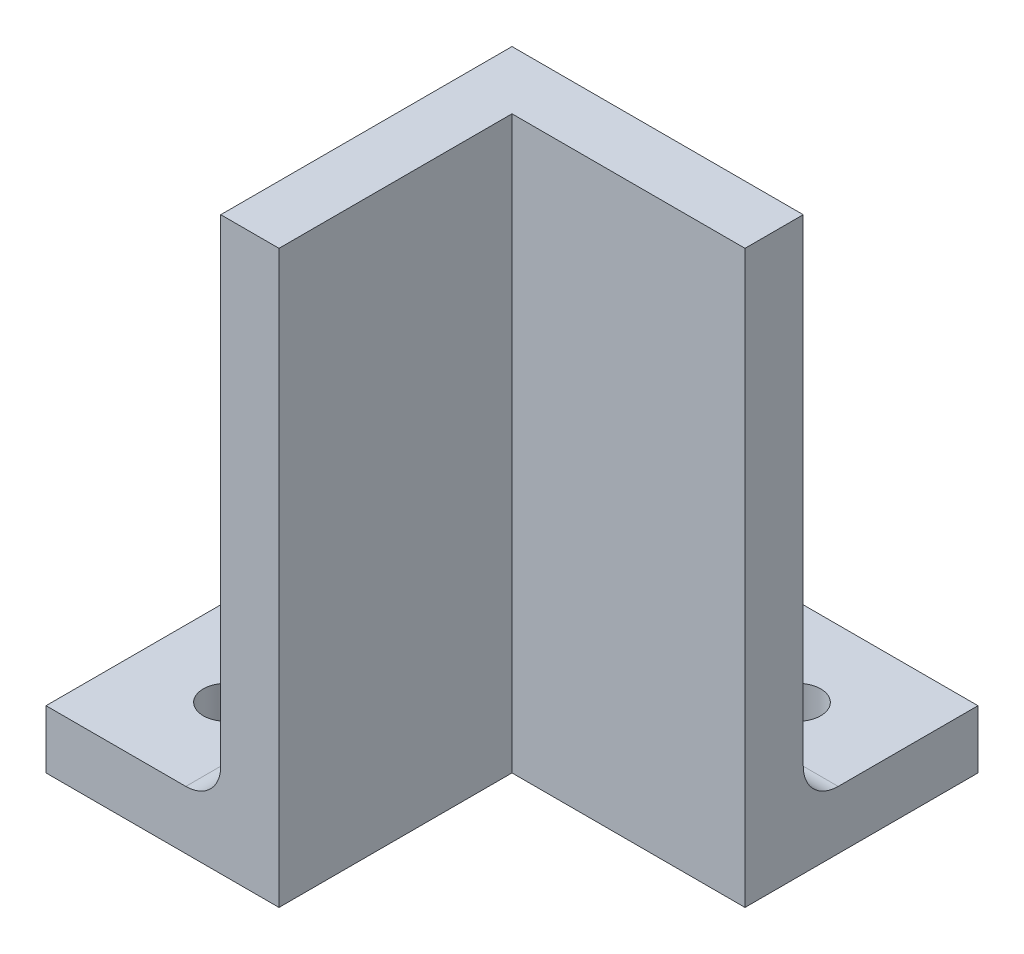
ISO-10303-21;
HEADER;
FILE_DESCRIPTION(('STEP AP214'),'2;1');
FILE_NAME('part.step','',(''),(''),'','','');
FILE_SCHEMA(('AUTOMOTIVE_DESIGN { 1 0 10303 214 1 1 1 1 }'));
ENDSEC;
DATA;
#1=APPLICATION_CONTEXT('core data for automotive mechanical design processes');
#2=APPLICATION_PROTOCOL_DEFINITION('international standard','automotive_design',2000,#1);
#3=PRODUCT_CONTEXT('',#1,'mechanical');
#4=PRODUCT('Part','Part','',(#3));
#5=PRODUCT_RELATED_PRODUCT_CATEGORY('part','',(#4));
#6=PRODUCT_DEFINITION_FORMATION('','',#4);
#7=PRODUCT_DEFINITION_CONTEXT('part definition',#1,'design');
#8=PRODUCT_DEFINITION('design','',#6,#7);
#9=PRODUCT_DEFINITION_SHAPE('','',#8);
#10=(LENGTH_UNIT() NAMED_UNIT(*) SI_UNIT(.MILLI.,.METRE.));
#11=(NAMED_UNIT(*) PLANE_ANGLE_UNIT() SI_UNIT($,.RADIAN.));
#12=(NAMED_UNIT(*) SI_UNIT($,.STERADIAN.) SOLID_ANGLE_UNIT());
#13=UNCERTAINTY_MEASURE_WITH_UNIT(LENGTH_MEASURE(1.E-05),#10,'distance_accuracy_value','');
#14=(GEOMETRIC_REPRESENTATION_CONTEXT(3) GLOBAL_UNCERTAINTY_ASSIGNED_CONTEXT((#13)) GLOBAL_UNIT_ASSIGNED_CONTEXT((#10,
#11,#12)) REPRESENTATION_CONTEXT('',''));
#15=CARTESIAN_POINT('',(0.,0.,0.));
#16=DIRECTION('',(0.,0.,1.));
#17=DIRECTION('',(1.,0.,0.));
#18=AXIS2_PLACEMENT_3D('',#15,#16,#17);
#19=CARTESIAN_POINT('',(0.,5.,0.));
#20=DIRECTION('',(0.,1.,0.));
#21=DIRECTION('',(0.,0.,1.));
#22=AXIS2_PLACEMENT_3D('',#19,#20,#21);
#23=PLANE('',#22);
#24=CARTESIAN_POINT('',(-12.5,5.,12.));
#25=DIRECTION('',(0.,1.,0.));
#26=DIRECTION('',(0.,0.,1.));
#27=AXIS2_PLACEMENT_3D('',#24,#25,#26);
#28=CIRCLE('',#27,2.);
#29=CARTESIAN_POINT('',(-12.5,5.,14.));
#30=VERTEX_POINT('',#29);
#31=EDGE_CURVE('E151',#30,#30,#28,.T.);
#32=ORIENTED_EDGE('',*,*,#31,.F.);
#33=EDGE_LOOP('',(#32));
#34=FACE_BOUND('',#33,.T.);
#35=CARTESIAN_POINT('',(-12.5,5.,0.));
#36=DIRECTION('',(0.,1.,0.));
#37=DIRECTION('',(0.,0.,1.));
#38=AXIS2_PLACEMENT_3D('',#35,#36,#37);
#39=CIRCLE('',#38,2.);
#40=CARTESIAN_POINT('',(-12.5,5.,2.));
#41=VERTEX_POINT('',#40);
#42=EDGE_CURVE('E217',#41,#41,#39,.T.);
#43=ORIENTED_EDGE('',*,*,#42,.F.);
#44=EDGE_LOOP('',(#43));
#45=FACE_BOUND('',#44,.T.);
#46=CARTESIAN_POINT('',(0.,5.,-12.5));
#47=DIRECTION('',(0.,1.,0.));
#48=DIRECTION('',(0.,0.,1.));
#49=AXIS2_PLACEMENT_3D('',#46,#47,#48);
#50=CIRCLE('',#49,2.);
#51=CARTESIAN_POINT('',(0.,5.,-10.5));
#52=VERTEX_POINT('',#51);
#53=EDGE_CURVE('E469',#52,#52,#50,.T.);
#54=ORIENTED_EDGE('',*,*,#53,.F.);
#55=EDGE_LOOP('',(#54));
#56=FACE_BOUND('',#55,.T.);
#57=CARTESIAN_POINT('',(12.,5.,-12.5));
#58=DIRECTION('',(0.,1.,0.));
#59=DIRECTION('',(0.,0.,1.));
#60=AXIS2_PLACEMENT_3D('',#57,#58,#59);
#61=CIRCLE('',#60,2.);
#62=CARTESIAN_POINT('',(12.,5.,-10.5));
#63=VERTEX_POINT('',#62);
#64=EDGE_CURVE('E154',#63,#63,#61,.T.);
#65=ORIENTED_EDGE('',*,*,#64,.F.);
#66=EDGE_LOOP('',(#65));
#67=FACE_BOUND('',#66,.T.);
#68=CARTESIAN_POINT('',(-12.5,5.,-12.5));
#69=DIRECTION('',(0.,1.,0.));
#70=DIRECTION('',(0.,0.,1.));
#71=AXIS2_PLACEMENT_3D('',#68,#69,#70);
#72=CIRCLE('',#71,2.);
#73=CARTESIAN_POINT('',(-12.5,5.,-10.5));
#74=VERTEX_POINT('',#73);
#75=EDGE_CURVE('E467',#74,#74,#72,.T.);
#76=ORIENTED_EDGE('',*,*,#75,.F.);
#77=EDGE_LOOP('',(#76));
#78=FACE_BOUND('',#77,.T.);
#79=DIRECTION('',(-1.,0.,0.));
#80=VECTOR('',#79,1.);
#81=CARTESIAN_POINT('',(20.,5.,-20.));
#82=LINE('',#81,#80);
#83=CARTESIAN_POINT('',(20.,5.,-20.));
#84=VERTEX_POINT('',#83);
#85=CARTESIAN_POINT('',(-17.,5.,-20.));
#86=VERTEX_POINT('',#85);
#87=EDGE_CURVE('E182',#84,#86,#82,.T.);
#88=ORIENTED_EDGE('',*,*,#87,.T.);
#89=CARTESIAN_POINT('',(-17.,5.,-17.));
#90=DIRECTION('',(0.,1.,0.));
#91=DIRECTION('',(0.,0.,1.));
#92=AXIS2_PLACEMENT_3D('',#89,#90,#91);
#93=CIRCLE('',#92,3.);
#94=CARTESIAN_POINT('',(-20.,5.,-17.));
#95=VERTEX_POINT('',#94);
#96=EDGE_CURVE('E11',#86,#95,#93,.T.);
#97=ORIENTED_EDGE('',*,*,#96,.T.);
#98=DIRECTION('',(0.,0.,1.));
#99=VECTOR('',#98,1.);
#100=CARTESIAN_POINT('',(-20.,5.,20.));
#101=LINE('',#100,#99);
#102=CARTESIAN_POINT('',(-20.,5.,20.));
#103=VERTEX_POINT('',#102);
#104=EDGE_CURVE('E174',#95,#103,#101,.T.);
#105=ORIENTED_EDGE('',*,*,#104,.T.);
#106=DIRECTION('',(1.,0.,0.));
#107=VECTOR('',#106,1.);
#108=CARTESIAN_POINT('',(-20.,5.,20.));
#109=LINE('',#108,#107);
#110=CARTESIAN_POINT('',(-8.,5.,20.));
#111=VERTEX_POINT('',#110);
#112=EDGE_CURVE('E176',#103,#111,#109,.T.);
#113=ORIENTED_EDGE('',*,*,#112,.T.);
#114=DIRECTION('',(0.,0.,-1.));
#115=VECTOR('',#114,1.);
#116=CARTESIAN_POINT('',(-8.,5.,-5.));
#117=LINE('',#116,#115);
#118=CARTESIAN_POINT('',(-8.,5.,-8.));
#119=VERTEX_POINT('',#118);
#120=EDGE_CURVE('E204',#111,#119,#117,.T.);
#121=ORIENTED_EDGE('',*,*,#120,.T.);
#122=DIRECTION('',(-1.,0.,0.));
#123=VECTOR('',#122,1.);
#124=CARTESIAN_POINT('',(0.,5.,-8.));
#125=LINE('',#124,#123);
#126=CARTESIAN_POINT('',(20.,5.,-8.));
#127=VERTEX_POINT('',#126);
#128=EDGE_CURVE('E206',#119,#127,#125,.F.);
#129=ORIENTED_EDGE('',*,*,#128,.T.);
#130=DIRECTION('',(0.,0.,-1.));
#131=VECTOR('',#130,1.);
#132=CARTESIAN_POINT('',(20.,5.,0.));
#133=LINE('',#132,#131);
#134=EDGE_CURVE('E180',#127,#84,#133,.T.);
#135=ORIENTED_EDGE('',*,*,#134,.T.);
#136=EDGE_LOOP('',(#88,#97,#105,#113,#121,#129,#135));
#137=FACE_BOUND('',#136,.T.);
#138=ADVANCED_FACE('F36',(#34,#45,#56,#67,#78,#137),#23,.T.);
#139=CARTESIAN_POINT('',(-20.,5.,20.));
#140=DIRECTION('',(1.,0.,0.));
#141=DIRECTION('',(0.,0.,-1.));
#142=AXIS2_PLACEMENT_3D('',#139,#140,#141);
#143=PLANE('',#142);
#144=ORIENTED_EDGE('',*,*,#104,.F.);
#145=DIRECTION('',(0.,-1.,0.));
#146=VECTOR('',#145,1.);
#147=CARTESIAN_POINT('',(-20.,5.,-17.));
#148=LINE('',#147,#146);
#149=CARTESIAN_POINT('',(-20.,0.,-17.));
#150=VERTEX_POINT('',#149);
#151=EDGE_CURVE('E214',#95,#150,#148,.T.);
#152=ORIENTED_EDGE('',*,*,#151,.T.);
#153=DIRECTION('',(0.,0.,1.));
#154=VECTOR('',#153,1.);
#155=CARTESIAN_POINT('',(-20.,0.,20.));
#156=LINE('',#155,#154);
#157=CARTESIAN_POINT('',(-20.,0.,20.));
#158=VERTEX_POINT('',#157);
#159=EDGE_CURVE('E173',#150,#158,#156,.T.);
#160=ORIENTED_EDGE('',*,*,#159,.T.);
#161=DIRECTION('',(0.,-1.,0.));
#162=VECTOR('',#161,1.);
#163=CARTESIAN_POINT('',(-20.,5.,20.));
#164=LINE('',#163,#162);
#165=EDGE_CURVE('E198',#103,#158,#164,.T.);
#166=ORIENTED_EDGE('',*,*,#165,.F.);
#167=EDGE_LOOP('',(#144,#152,#160,#166));
#168=FACE_BOUND('',#167,.T.);
#169=ADVANCED_FACE('F223',(#168),#143,.F.);
#170=CARTESIAN_POINT('',(-20.,5.,20.));
#171=DIRECTION('',(0.,0.,-1.));
#172=DIRECTION('',(-1.,0.,0.));
#173=AXIS2_PLACEMENT_3D('',#170,#171,#172);
#174=PLANE('',#173);
#175=DIRECTION('',(1.,0.,0.));
#176=VECTOR('',#175,1.);
#177=CARTESIAN_POINT('',(-20.,0.,20.));
#178=LINE('',#177,#176);
#179=CARTESIAN_POINT('',(0.,0.,20.));
#180=VERTEX_POINT('',#179);
#181=EDGE_CURVE('E186',#158,#180,#178,.T.);
#182=ORIENTED_EDGE('',*,*,#181,.T.);
#183=DIRECTION('',(0.,-1.,0.));
#184=VECTOR('',#183,1.);
#185=CARTESIAN_POINT('',(0.,5.,20.));
#186=LINE('',#185,#184);
#187=CARTESIAN_POINT('',(0.,49.,20.));
#188=VERTEX_POINT('',#187);
#189=EDGE_CURVE('E132',#188,#180,#186,.T.);
#190=ORIENTED_EDGE('',*,*,#189,.F.);
#191=DIRECTION('',(1.,0.,0.));
#192=VECTOR('',#191,1.);
#193=CARTESIAN_POINT('',(0.,49.,20.));
#194=LINE('',#193,#192);
#195=CARTESIAN_POINT('',(-5.,49.,20.));
#196=VERTEX_POINT('',#195);
#197=EDGE_CURVE('E147',#196,#188,#194,.T.);
#198=ORIENTED_EDGE('',*,*,#197,.F.);
#199=DIRECTION('',(0.,-1.,0.));
#200=VECTOR('',#199,1.);
#201=CARTESIAN_POINT('',(-5.,49.,20.));
#202=LINE('',#201,#200);
#203=CARTESIAN_POINT('',(-5.,8.,20.));
#204=VERTEX_POINT('',#203);
#205=EDGE_CURVE('E164',#196,#204,#202,.T.);
#206=ORIENTED_EDGE('',*,*,#205,.T.);
#207=CARTESIAN_POINT('',(-8.,8.,20.));
#208=DIRECTION('',(0.,0.,-1.));
#209=DIRECTION('',(-1.,0.,0.));
#210=AXIS2_PLACEMENT_3D('',#207,#208,#209);
#211=CIRCLE('',#210,3.);
#212=EDGE_CURVE('E212',#204,#111,#211,.T.);
#213=ORIENTED_EDGE('',*,*,#212,.T.);
#214=ORIENTED_EDGE('',*,*,#112,.F.);
#215=ORIENTED_EDGE('',*,*,#165,.T.);
#216=EDGE_LOOP('',(#182,#190,#198,#206,#213,#214,#215));
#217=FACE_BOUND('',#216,.T.);
#218=ADVANCED_FACE('F231',(#217),#174,.F.);
#219=CARTESIAN_POINT('',(0.,5.,20.));
#220=DIRECTION('',(-1.,0.,0.));
#221=DIRECTION('',(0.,0.,1.));
#222=AXIS2_PLACEMENT_3D('',#219,#220,#221);
#223=PLANE('',#222);
#224=DIRECTION('',(0.,0.,-1.));
#225=VECTOR('',#224,1.);
#226=CARTESIAN_POINT('',(0.,0.,20.));
#227=LINE('',#226,#225);
#228=CARTESIAN_POINT('',(0.,0.,0.));
#229=VERTEX_POINT('',#228);
#230=EDGE_CURVE('E129',#180,#229,#227,.T.);
#231=ORIENTED_EDGE('',*,*,#230,.T.);
#232=DIRECTION('',(0.,-1.,0.));
#233=VECTOR('',#232,1.);
#234=CARTESIAN_POINT('',(0.,5.,0.));
#235=LINE('',#234,#233);
#236=CARTESIAN_POINT('',(0.,49.,0.));
#237=VERTEX_POINT('',#236);
#238=EDGE_CURVE('E122',#237,#229,#235,.T.);
#239=ORIENTED_EDGE('',*,*,#238,.F.);
#240=DIRECTION('',(0.,0.,-1.));
#241=VECTOR('',#240,1.);
#242=CARTESIAN_POINT('',(0.,49.,0.));
#243=LINE('',#242,#241);
#244=EDGE_CURVE('E127',#188,#237,#243,.T.);
#245=ORIENTED_EDGE('',*,*,#244,.F.);
#246=ORIENTED_EDGE('',*,*,#189,.T.);
#247=EDGE_LOOP('',(#231,#239,#245,#246));
#248=FACE_BOUND('',#247,.T.);
#249=ADVANCED_FACE('F124',(#248),#223,.F.);
#250=CARTESIAN_POINT('',(0.,5.,0.));
#251=DIRECTION('',(0.,0.,-1.));
#252=DIRECTION('',(-1.,0.,0.));
#253=AXIS2_PLACEMENT_3D('',#250,#251,#252);
#254=PLANE('',#253);
#255=DIRECTION('',(1.,0.,0.));
#256=VECTOR('',#255,1.);
#257=CARTESIAN_POINT('',(0.,0.,0.));
#258=LINE('',#257,#256);
#259=CARTESIAN_POINT('',(20.,0.,0.));
#260=VERTEX_POINT('',#259);
#261=EDGE_CURVE('E189',#229,#260,#258,.T.);
#262=ORIENTED_EDGE('',*,*,#261,.T.);
#263=DIRECTION('',(0.,-1.,0.));
#264=VECTOR('',#263,1.);
#265=CARTESIAN_POINT('',(20.,5.,0.));
#266=LINE('',#265,#264);
#267=CARTESIAN_POINT('',(20.,49.,0.));
#268=VERTEX_POINT('',#267);
#269=EDGE_CURVE('E133',#268,#260,#266,.T.);
#270=ORIENTED_EDGE('',*,*,#269,.F.);
#271=DIRECTION('',(1.,0.,0.));
#272=VECTOR('',#271,1.);
#273=CARTESIAN_POINT('',(0.,49.,0.));
#274=LINE('',#273,#272);
#275=EDGE_CURVE('E136',#237,#268,#274,.T.);
#276=ORIENTED_EDGE('',*,*,#275,.F.);
#277=ORIENTED_EDGE('',*,*,#238,.T.);
#278=EDGE_LOOP('',(#262,#270,#276,#277));
#279=FACE_BOUND('',#278,.T.);
#280=ADVANCED_FACE('F137',(#279),#254,.F.);
#281=CARTESIAN_POINT('',(20.,5.,0.));
#282=DIRECTION('',(-1.,0.,0.));
#283=DIRECTION('',(0.,0.,1.));
#284=AXIS2_PLACEMENT_3D('',#281,#282,#283);
#285=PLANE('',#284);
#286=DIRECTION('',(0.,0.,-1.));
#287=VECTOR('',#286,1.);
#288=CARTESIAN_POINT('',(20.,0.,0.));
#289=LINE('',#288,#287);
#290=CARTESIAN_POINT('',(20.,0.,-20.));
#291=VERTEX_POINT('',#290);
#292=EDGE_CURVE('E191',#260,#291,#289,.T.);
#293=ORIENTED_EDGE('',*,*,#292,.T.);
#294=DIRECTION('',(0.,-1.,0.));
#295=VECTOR('',#294,1.);
#296=CARTESIAN_POINT('',(20.,5.,-20.));
#297=LINE('',#296,#295);
#298=EDGE_CURVE('E184',#84,#291,#297,.T.);
#299=ORIENTED_EDGE('',*,*,#298,.F.);
#300=ORIENTED_EDGE('',*,*,#134,.F.);
#301=CARTESIAN_POINT('',(20.,8.,-8.));
#302=DIRECTION('',(-1.,0.,0.));
#303=DIRECTION('',(0.,0.,1.));
#304=AXIS2_PLACEMENT_3D('',#301,#302,#303);
#305=CIRCLE('',#304,3.);
#306=CARTESIAN_POINT('',(20.,8.,-5.));
#307=VERTEX_POINT('',#306);
#308=EDGE_CURVE('E210',#127,#307,#305,.T.);
#309=ORIENTED_EDGE('',*,*,#308,.T.);
#310=DIRECTION('',(0.,-1.,0.));
#311=VECTOR('',#310,1.);
#312=CARTESIAN_POINT('',(20.,49.,-5.));
#313=LINE('',#312,#311);
#314=CARTESIAN_POINT('',(20.,49.,-5.));
#315=VERTEX_POINT('',#314);
#316=EDGE_CURVE('E170',#315,#307,#313,.T.);
#317=ORIENTED_EDGE('',*,*,#316,.F.);
#318=DIRECTION('',(0.,0.,-1.));
#319=VECTOR('',#318,1.);
#320=CARTESIAN_POINT('',(20.,49.,0.));
#321=LINE('',#320,#319);
#322=EDGE_CURVE('E141',#268,#315,#321,.T.);
#323=ORIENTED_EDGE('',*,*,#322,.F.);
#324=ORIENTED_EDGE('',*,*,#269,.T.);
#325=EDGE_LOOP('',(#293,#299,#300,#309,#317,#323,#324));
#326=FACE_BOUND('',#325,.T.);
#327=ADVANCED_FACE('F247',(#326),#285,.F.);
#328=CARTESIAN_POINT('',(20.,5.,-20.));
#329=DIRECTION('',(0.,0.,1.));
#330=DIRECTION('',(1.,0.,0.));
#331=AXIS2_PLACEMENT_3D('',#328,#329,#330);
#332=PLANE('',#331);
#333=DIRECTION('',(-1.,0.,0.));
#334=VECTOR('',#333,1.);
#335=CARTESIAN_POINT('',(20.,0.,-20.));
#336=LINE('',#335,#334);
#337=CARTESIAN_POINT('',(-17.,0.,-20.));
#338=VERTEX_POINT('',#337);
#339=EDGE_CURVE('E177',#291,#338,#336,.T.);
#340=ORIENTED_EDGE('',*,*,#339,.T.);
#341=DIRECTION('',(0.,-1.,0.));
#342=VECTOR('',#341,1.);
#343=CARTESIAN_POINT('',(-17.,5.,-20.));
#344=LINE('',#343,#342);
#345=EDGE_CURVE('E44',#338,#86,#344,.F.);
#346=ORIENTED_EDGE('',*,*,#345,.T.);
#347=ORIENTED_EDGE('',*,*,#87,.F.);
#348=ORIENTED_EDGE('',*,*,#298,.T.);
#349=EDGE_LOOP('',(#340,#346,#347,#348));
#350=FACE_BOUND('',#349,.T.);
#351=ADVANCED_FACE('F250',(#350),#332,.F.);
#352=CARTESIAN_POINT('',(0.,0.,0.));
#353=DIRECTION('',(0.,1.,0.));
#354=DIRECTION('',(0.,0.,1.));
#355=AXIS2_PLACEMENT_3D('',#352,#353,#354);
#356=PLANE('',#355);
#357=CARTESIAN_POINT('',(-12.5,0.,12.));
#358=DIRECTION('',(0.,1.,0.));
#359=DIRECTION('',(0.,0.,1.));
#360=AXIS2_PLACEMENT_3D('',#357,#358,#359);
#361=CIRCLE('',#360,2.);
#362=CARTESIAN_POINT('',(-12.5,0.,14.));
#363=VERTEX_POINT('',#362);
#364=EDGE_CURVE('E148',#363,#363,#361,.T.);
#365=ORIENTED_EDGE('',*,*,#364,.T.);
#366=EDGE_LOOP('',(#365));
#367=FACE_BOUND('',#366,.T.);
#368=CARTESIAN_POINT('',(-12.5,0.,0.));
#369=DIRECTION('',(0.,1.,0.));
#370=DIRECTION('',(0.,0.,1.));
#371=AXIS2_PLACEMENT_3D('',#368,#369,#370);
#372=CIRCLE('',#371,2.);
#373=CARTESIAN_POINT('',(-12.5,0.,2.));
#374=VERTEX_POINT('',#373);
#375=EDGE_CURVE('E474',#374,#374,#372,.T.);
#376=ORIENTED_EDGE('',*,*,#375,.T.);
#377=EDGE_LOOP('',(#376));
#378=FACE_BOUND('',#377,.T.);
#379=CARTESIAN_POINT('',(0.,0.,-12.5));
#380=DIRECTION('',(0.,1.,0.));
#381=DIRECTION('',(0.,0.,1.));
#382=AXIS2_PLACEMENT_3D('',#379,#380,#381);
#383=CIRCLE('',#382,2.);
#384=CARTESIAN_POINT('',(0.,0.,-10.5));
#385=VERTEX_POINT('',#384);
#386=EDGE_CURVE('E466',#385,#385,#383,.T.);
#387=ORIENTED_EDGE('',*,*,#386,.T.);
#388=EDGE_LOOP('',(#387));
#389=FACE_BOUND('',#388,.T.);
#390=CARTESIAN_POINT('',(12.,0.,-12.5));
#391=DIRECTION('',(0.,1.,0.));
#392=DIRECTION('',(0.,0.,1.));
#393=AXIS2_PLACEMENT_3D('',#390,#391,#392);
#394=CIRCLE('',#393,2.);
#395=CARTESIAN_POINT('',(12.,0.,-10.5));
#396=VERTEX_POINT('',#395);
#397=EDGE_CURVE('E462',#396,#396,#394,.T.);
#398=ORIENTED_EDGE('',*,*,#397,.T.);
#399=EDGE_LOOP('',(#398));
#400=FACE_BOUND('',#399,.T.);
#401=CARTESIAN_POINT('',(-12.5,0.,-12.5));
#402=DIRECTION('',(0.,1.,0.));
#403=DIRECTION('',(0.,0.,1.));
#404=AXIS2_PLACEMENT_3D('',#401,#402,#403);
#405=CIRCLE('',#404,2.);
#406=CARTESIAN_POINT('',(-12.5,0.,-10.5));
#407=VERTEX_POINT('',#406);
#408=EDGE_CURVE('E482',#407,#407,#405,.T.);
#409=ORIENTED_EDGE('',*,*,#408,.T.);
#410=EDGE_LOOP('',(#409));
#411=FACE_BOUND('',#410,.T.);
#412=ORIENTED_EDGE('',*,*,#159,.F.);
#413=CARTESIAN_POINT('',(-17.,0.,-17.));
#414=DIRECTION('',(0.,1.,0.));
#415=DIRECTION('',(0.,0.,1.));
#416=AXIS2_PLACEMENT_3D('',#413,#414,#415);
#417=CIRCLE('',#416,3.);
#418=EDGE_CURVE('E58',#150,#338,#417,.F.);
#419=ORIENTED_EDGE('',*,*,#418,.T.);
#420=ORIENTED_EDGE('',*,*,#339,.F.);
#421=ORIENTED_EDGE('',*,*,#292,.F.);
#422=ORIENTED_EDGE('',*,*,#261,.F.);
#423=ORIENTED_EDGE('',*,*,#230,.F.);
#424=ORIENTED_EDGE('',*,*,#181,.F.);
#425=EDGE_LOOP('',(#412,#419,#420,#421,#422,#423,#424));
#426=FACE_BOUND('',#425,.T.);
#427=ADVANCED_FACE('F228',(#367,#378,#389,#400,#411,#426),#356,.F.);
#428=CARTESIAN_POINT('',(0.,49.,-5.));
#429=DIRECTION('',(0.,0.,1.));
#430=DIRECTION('',(1.,0.,0.));
#431=AXIS2_PLACEMENT_3D('',#428,#429,#430);
#432=PLANE('',#431);
#433=ORIENTED_EDGE('',*,*,#316,.T.);
#434=DIRECTION('',(-1.,0.,0.));
#435=VECTOR('',#434,1.);
#436=CARTESIAN_POINT('',(0.,8.,-5.));
#437=LINE('',#436,#435);
#438=CARTESIAN_POINT('',(-5.,8.,-5.));
#439=VERTEX_POINT('',#438);
#440=EDGE_CURVE('E201',#307,#439,#437,.T.);
#441=ORIENTED_EDGE('',*,*,#440,.T.);
#442=DIRECTION('',(0.,-1.,0.));
#443=VECTOR('',#442,1.);
#444=CARTESIAN_POINT('',(-5.,49.,-5.));
#445=LINE('',#444,#443);
#446=CARTESIAN_POINT('',(-5.,49.,-5.));
#447=VERTEX_POINT('',#446);
#448=EDGE_CURVE('E167',#447,#439,#445,.T.);
#449=ORIENTED_EDGE('',*,*,#448,.F.);
#450=DIRECTION('',(-1.,0.,0.));
#451=VECTOR('',#450,1.);
#452=CARTESIAN_POINT('',(0.,49.,-5.));
#453=LINE('',#452,#451);
#454=EDGE_CURVE('E158',#315,#447,#453,.T.);
#455=ORIENTED_EDGE('',*,*,#454,.F.);
#456=EDGE_LOOP('',(#433,#441,#449,#455));
#457=FACE_BOUND('',#456,.T.);
#458=ADVANCED_FACE('F267',(#457),#432,.F.);
#459=CARTESIAN_POINT('',(-5.,49.,0.));
#460=DIRECTION('',(-1.,0.,0.));
#461=DIRECTION('',(0.,0.,1.));
#462=AXIS2_PLACEMENT_3D('',#459,#460,#461);
#463=PLANE('',#462);
#464=ORIENTED_EDGE('',*,*,#448,.T.);
#465=DIRECTION('',(0.,0.,-1.));
#466=VECTOR('',#465,1.);
#467=CARTESIAN_POINT('',(-5.,8.,20.));
#468=LINE('',#467,#466);
#469=EDGE_CURVE('E208',#439,#204,#468,.F.);
#470=ORIENTED_EDGE('',*,*,#469,.T.);
#471=ORIENTED_EDGE('',*,*,#205,.F.);
#472=DIRECTION('',(0.,0.,-1.));
#473=VECTOR('',#472,1.);
#474=CARTESIAN_POINT('',(-5.,49.,0.));
#475=LINE('',#474,#473);
#476=EDGE_CURVE('E160',#196,#447,#475,.T.);
#477=ORIENTED_EDGE('',*,*,#476,.T.);
#478=EDGE_LOOP('',(#464,#470,#471,#477));
#479=FACE_BOUND('',#478,.T.);
#480=ADVANCED_FACE('F310',(#479),#463,.T.);
#481=CARTESIAN_POINT('',(0.,49.,0.));
#482=DIRECTION('',(0.,1.,0.));
#483=DIRECTION('',(0.,0.,1.));
#484=AXIS2_PLACEMENT_3D('',#481,#482,#483);
#485=PLANE('',#484);
#486=ORIENTED_EDGE('',*,*,#244,.T.);
#487=ORIENTED_EDGE('',*,*,#275,.T.);
#488=ORIENTED_EDGE('',*,*,#322,.T.);
#489=ORIENTED_EDGE('',*,*,#454,.T.);
#490=ORIENTED_EDGE('',*,*,#476,.F.);
#491=ORIENTED_EDGE('',*,*,#197,.T.);
#492=EDGE_LOOP('',(#486,#487,#488,#489,#490,#491));
#493=FACE_BOUND('',#492,.T.);
#494=ADVANCED_FACE('F144',(#493),#485,.T.);
#495=CARTESIAN_POINT('',(-12.5,0.,-12.5));
#496=DIRECTION('',(0.,1.,0.));
#497=DIRECTION('',(0.,0.,1.));
#498=AXIS2_PLACEMENT_3D('',#495,#496,#497);
#499=CYLINDRICAL_SURFACE('',#498,2.);
#500=ORIENTED_EDGE('',*,*,#408,.F.);
#501=EDGE_LOOP('',(#500));
#502=FACE_BOUND('',#501,.T.);
#503=ORIENTED_EDGE('',*,*,#75,.T.);
#504=EDGE_LOOP('',(#503));
#505=FACE_BOUND('',#504,.T.);
#506=ADVANCED_FACE('F302',(#502,#505),#499,.F.);
#507=CARTESIAN_POINT('',(12.,0.,-12.5));
#508=DIRECTION('',(0.,1.,0.));
#509=DIRECTION('',(0.,0.,1.));
#510=AXIS2_PLACEMENT_3D('',#507,#508,#509);
#511=CYLINDRICAL_SURFACE('',#510,2.);
#512=ORIENTED_EDGE('',*,*,#397,.F.);
#513=EDGE_LOOP('',(#512));
#514=FACE_BOUND('',#513,.T.);
#515=ORIENTED_EDGE('',*,*,#64,.T.);
#516=EDGE_LOOP('',(#515));
#517=FACE_BOUND('',#516,.T.);
#518=ADVANCED_FACE('F299',(#514,#517),#511,.F.);
#519=CARTESIAN_POINT('',(0.,0.,-12.5));
#520=DIRECTION('',(0.,1.,0.));
#521=DIRECTION('',(0.,0.,1.));
#522=AXIS2_PLACEMENT_3D('',#519,#520,#521);
#523=CYLINDRICAL_SURFACE('',#522,2.);
#524=ORIENTED_EDGE('',*,*,#386,.F.);
#525=EDGE_LOOP('',(#524));
#526=FACE_BOUND('',#525,.T.);
#527=ORIENTED_EDGE('',*,*,#53,.T.);
#528=EDGE_LOOP('',(#527));
#529=FACE_BOUND('',#528,.T.);
#530=ADVANCED_FACE('F292',(#526,#529),#523,.F.);
#531=CARTESIAN_POINT('',(-12.5,0.,0.));
#532=DIRECTION('',(0.,1.,0.));
#533=DIRECTION('',(0.,0.,1.));
#534=AXIS2_PLACEMENT_3D('',#531,#532,#533);
#535=CYLINDRICAL_SURFACE('',#534,2.);
#536=ORIENTED_EDGE('',*,*,#375,.F.);
#537=EDGE_LOOP('',(#536));
#538=FACE_BOUND('',#537,.T.);
#539=ORIENTED_EDGE('',*,*,#42,.T.);
#540=EDGE_LOOP('',(#539));
#541=FACE_BOUND('',#540,.T.);
#542=ADVANCED_FACE('F286',(#538,#541),#535,.F.);
#543=CARTESIAN_POINT('',(-12.5,0.,12.));
#544=DIRECTION('',(0.,1.,0.));
#545=DIRECTION('',(0.,0.,1.));
#546=AXIS2_PLACEMENT_3D('',#543,#544,#545);
#547=CYLINDRICAL_SURFACE('',#546,2.);
#548=ORIENTED_EDGE('',*,*,#364,.F.);
#549=EDGE_LOOP('',(#548));
#550=FACE_BOUND('',#549,.T.);
#551=ORIENTED_EDGE('',*,*,#31,.T.);
#552=EDGE_LOOP('',(#551));
#553=FACE_BOUND('',#552,.T.);
#554=ADVANCED_FACE('F282',(#550,#553),#547,.F.);
#555=CARTESIAN_POINT('',(-8.,8.,0.));
#556=DIRECTION('',(0.,0.,1.));
#557=DIRECTION('',(1.,0.,0.));
#558=AXIS2_PLACEMENT_3D('',#555,#556,#557);
#559=CYLINDRICAL_SURFACE('',#558,3.);
#560=ORIENTED_EDGE('',*,*,#212,.F.);
#561=ORIENTED_EDGE('',*,*,#469,.F.);
#562=CARTESIAN_POINT('',(-8.,8.,-8.));
#563=DIRECTION('',(-0.707106781186547,0.,0.707106781186548));
#564=DIRECTION('',(0.707106781186547,0.,0.707106781186547));
#565=AXIS2_PLACEMENT_3D('',#562,#563,#564);
#566=ELLIPSE('',#565,4.24264068711929,3.);
#567=EDGE_CURVE('E215',#119,#439,#566,.T.);
#568=ORIENTED_EDGE('',*,*,#567,.F.);
#569=ORIENTED_EDGE('',*,*,#120,.F.);
#570=EDGE_LOOP('',(#560,#561,#568,#569));
#571=FACE_BOUND('',#570,.T.);
#572=ADVANCED_FACE('F238',(#571),#559,.F.);
#573=CARTESIAN_POINT('',(0.,8.,-8.));
#574=DIRECTION('',(-1.,0.,0.));
#575=DIRECTION('',(0.,0.,1.));
#576=AXIS2_PLACEMENT_3D('',#573,#574,#575);
#577=CYLINDRICAL_SURFACE('',#576,3.);
#578=ORIENTED_EDGE('',*,*,#308,.F.);
#579=ORIENTED_EDGE('',*,*,#128,.F.);
#580=ORIENTED_EDGE('',*,*,#567,.T.);
#581=ORIENTED_EDGE('',*,*,#440,.F.);
#582=EDGE_LOOP('',(#578,#579,#580,#581));
#583=FACE_BOUND('',#582,.T.);
#584=ADVANCED_FACE('F243',(#583),#577,.F.);
#585=CARTESIAN_POINT('',(-17.,5.,-17.));
#586=DIRECTION('',(0.,-1.,0.));
#587=DIRECTION('',(0.,0.,-1.));
#588=AXIS2_PLACEMENT_3D('',#585,#586,#587);
#589=CYLINDRICAL_SURFACE('',#588,3.);
#590=ORIENTED_EDGE('',*,*,#96,.F.);
#591=ORIENTED_EDGE('',*,*,#345,.F.);
#592=ORIENTED_EDGE('',*,*,#418,.F.);
#593=ORIENTED_EDGE('',*,*,#151,.F.);
#594=EDGE_LOOP('',(#590,#591,#592,#593));
#595=FACE_BOUND('',#594,.T.);
#596=ADVANCED_FACE('F38',(#595),#589,.T.);
#597=CLOSED_SHELL('',(#138,#169,#218,#249,#280,#327,#351,#427,#458,#480,#494,#506,#518,#530,
#542,#554,#572,#584,#596));
#598=MANIFOLD_SOLID_BREP('B2',#597);
#599=ADVANCED_BREP_SHAPE_REPRESENTATION('',(#18,#598),#14);
#600=SHAPE_DEFINITION_REPRESENTATION(#9,#599);
ENDSEC;
END-ISO-10303-21;
